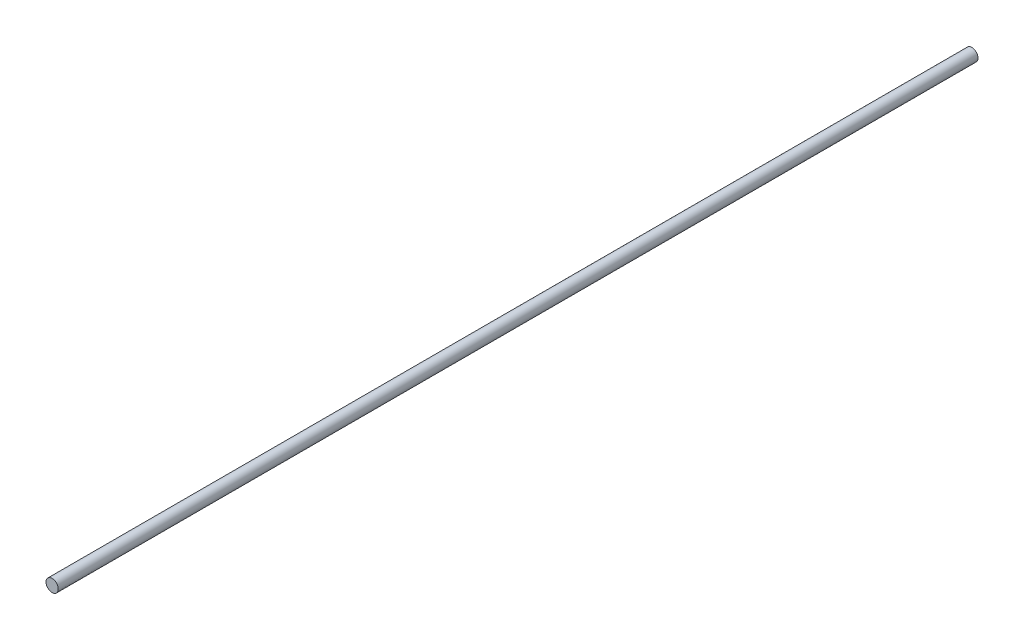
ISO-10303-21;
HEADER;
FILE_DESCRIPTION(('STEP AP214'),'2;1');
FILE_NAME('part.step','',(''),(''),'','','');
FILE_SCHEMA(('AUTOMOTIVE_DESIGN { 1 0 10303 214 1 1 1 1 }'));
ENDSEC;
DATA;
#1=APPLICATION_CONTEXT('core data for automotive mechanical design processes');
#2=APPLICATION_PROTOCOL_DEFINITION('international standard','automotive_design',2000,#1);
#3=PRODUCT_CONTEXT('',#1,'mechanical');
#4=PRODUCT('Part','Part','',(#3));
#5=PRODUCT_RELATED_PRODUCT_CATEGORY('part','',(#4));
#6=PRODUCT_DEFINITION_FORMATION('','',#4);
#7=PRODUCT_DEFINITION_CONTEXT('part definition',#1,'design');
#8=PRODUCT_DEFINITION('design','',#6,#7);
#9=PRODUCT_DEFINITION_SHAPE('','',#8);
#10=(LENGTH_UNIT() NAMED_UNIT(*) SI_UNIT(.MILLI.,.METRE.));
#11=(NAMED_UNIT(*) PLANE_ANGLE_UNIT() SI_UNIT($,.RADIAN.));
#12=(NAMED_UNIT(*) SI_UNIT($,.STERADIAN.) SOLID_ANGLE_UNIT());
#13=UNCERTAINTY_MEASURE_WITH_UNIT(LENGTH_MEASURE(1.E-05),#10,'distance_accuracy_value','');
#14=(GEOMETRIC_REPRESENTATION_CONTEXT(3) GLOBAL_UNCERTAINTY_ASSIGNED_CONTEXT((#13)) GLOBAL_UNIT_ASSIGNED_CONTEXT((#10,
#11,#12)) REPRESENTATION_CONTEXT('',''));
#15=CARTESIAN_POINT('',(0.,0.,0.));
#16=DIRECTION('',(0.,0.,1.));
#17=DIRECTION('',(1.,0.,0.));
#18=AXIS2_PLACEMENT_3D('',#15,#16,#17);
#19=CARTESIAN_POINT('',(0.,0.,225.));
#20=DIRECTION('',(0.,0.,-1.));
#21=DIRECTION('',(-1.,0.,0.));
#22=AXIS2_PLACEMENT_3D('',#19,#20,#21);
#23=CYLINDRICAL_SURFACE('',#22,1.5);
#24=CARTESIAN_POINT('',(0.,0.,225.));
#25=DIRECTION('',(0.,0.,1.));
#26=DIRECTION('',(1.,0.,0.));
#27=AXIS2_PLACEMENT_3D('',#24,#25,#26);
#28=CIRCLE('',#27,1.5);
#29=CARTESIAN_POINT('',(1.5,0.,225.));
#30=VERTEX_POINT('',#29);
#31=EDGE_CURVE('E10',#30,#30,#28,.T.);
#32=ORIENTED_EDGE('',*,*,#31,.F.);
#33=EDGE_LOOP('',(#32));
#34=FACE_BOUND('',#33,.T.);
#35=CARTESIAN_POINT('',(0.,0.,0.));
#36=DIRECTION('',(0.,0.,1.));
#37=DIRECTION('',(1.,0.,0.));
#38=AXIS2_PLACEMENT_3D('',#35,#36,#37);
#39=CIRCLE('',#38,1.5);
#40=CARTESIAN_POINT('',(1.5,0.,0.));
#41=VERTEX_POINT('',#40);
#42=EDGE_CURVE('E40',#41,#41,#39,.T.);
#43=ORIENTED_EDGE('',*,*,#42,.T.);
#44=EDGE_LOOP('',(#43));
#45=FACE_BOUND('',#44,.T.);
#46=ADVANCED_FACE('F37',(#34,#45),#23,.T.);
#47=CARTESIAN_POINT('',(0.,0.,225.));
#48=DIRECTION('',(0.,0.,1.));
#49=DIRECTION('',(1.,0.,0.));
#50=AXIS2_PLACEMENT_3D('',#47,#48,#49);
#51=PLANE('',#50);
#52=ORIENTED_EDGE('',*,*,#31,.T.);
#53=EDGE_LOOP('',(#52));
#54=FACE_BOUND('',#53,.T.);
#55=ADVANCED_FACE('F54',(#54),#51,.T.);
#56=CARTESIAN_POINT('',(0.,0.,0.));
#57=DIRECTION('',(0.,0.,1.));
#58=DIRECTION('',(1.,0.,0.));
#59=AXIS2_PLACEMENT_3D('',#56,#57,#58);
#60=PLANE('',#59);
#61=ORIENTED_EDGE('',*,*,#42,.F.);
#62=EDGE_LOOP('',(#61));
#63=FACE_BOUND('',#62,.T.);
#64=ADVANCED_FACE('F52',(#63),#60,.F.);
#65=CLOSED_SHELL('',(#46,#55,#64));
#66=MANIFOLD_SOLID_BREP('B2',#65);
#67=ADVANCED_BREP_SHAPE_REPRESENTATION('',(#18,#66),#14);
#68=SHAPE_DEFINITION_REPRESENTATION(#9,#67);
ENDSEC;
END-ISO-10303-21;
